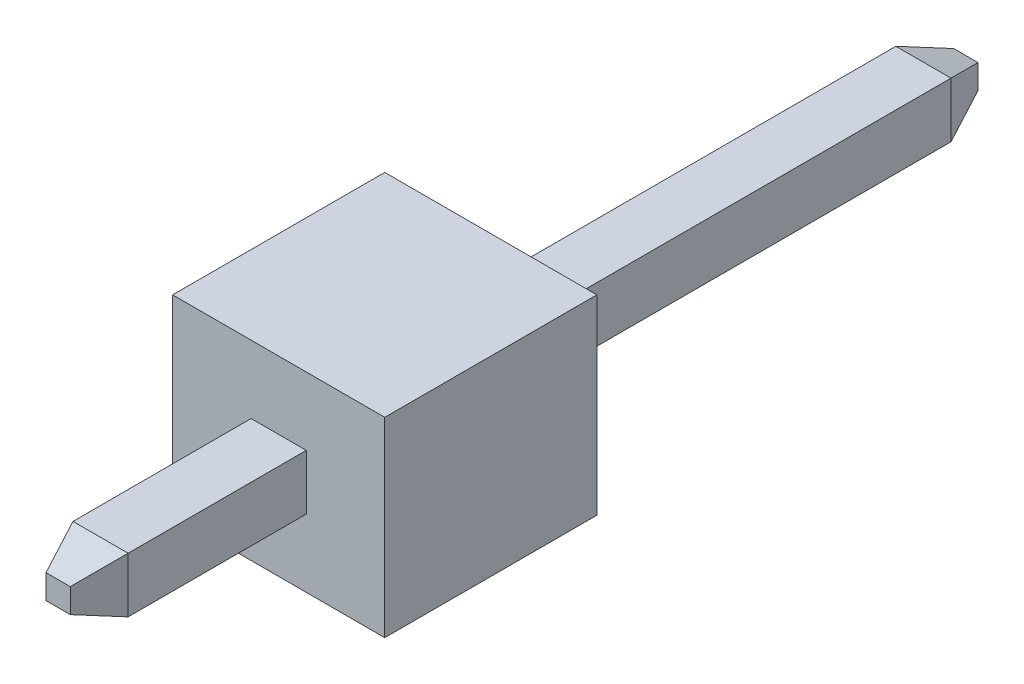
ISO-10303-21;
HEADER;
FILE_DESCRIPTION(('STEP AP214'),'2;1');
FILE_NAME('part.step','',(''),(''),'','','');
FILE_SCHEMA(('AUTOMOTIVE_DESIGN { 1 0 10303 214 1 1 1 1 }'));
ENDSEC;
DATA;
#1=APPLICATION_CONTEXT('core data for automotive mechanical design processes');
#2=APPLICATION_PROTOCOL_DEFINITION('international standard','automotive_design',2000,#1);
#3=PRODUCT_CONTEXT('',#1,'mechanical');
#4=PRODUCT('Part','Part','',(#3));
#5=PRODUCT_RELATED_PRODUCT_CATEGORY('part','',(#4));
#6=PRODUCT_DEFINITION_FORMATION('','',#4);
#7=PRODUCT_DEFINITION_CONTEXT('part definition',#1,'design');
#8=PRODUCT_DEFINITION('design','',#6,#7);
#9=PRODUCT_DEFINITION_SHAPE('','',#8);
#10=(LENGTH_UNIT() NAMED_UNIT(*) SI_UNIT(.MILLI.,.METRE.));
#11=(NAMED_UNIT(*) PLANE_ANGLE_UNIT() SI_UNIT($,.RADIAN.));
#12=(NAMED_UNIT(*) SI_UNIT($,.STERADIAN.) SOLID_ANGLE_UNIT());
#13=UNCERTAINTY_MEASURE_WITH_UNIT(LENGTH_MEASURE(1.E-05),#10,'distance_accuracy_value','');
#14=(GEOMETRIC_REPRESENTATION_CONTEXT(3) GLOBAL_UNCERTAINTY_ASSIGNED_CONTEXT((#13)) GLOBAL_UNIT_ASSIGNED_CONTEXT((#10,
#11,#12)) REPRESENTATION_CONTEXT('',''));
#15=CARTESIAN_POINT('',(0.,0.,0.));
#16=DIRECTION('',(0.,0.,1.));
#17=DIRECTION('',(1.,0.,0.));
#18=AXIS2_PLACEMENT_3D('',#15,#16,#17);
#19=CARTESIAN_POINT('',(-1.25,-1.125,1.25));
#20=DIRECTION('',(1.,0.,0.));
#21=DIRECTION('',(0.,0.,-1.));
#22=AXIS2_PLACEMENT_3D('',#19,#20,#21);
#23=PLANE('',#22);
#24=DIRECTION('',(0.,-1.,0.));
#25=VECTOR('',#24,1.);
#26=CARTESIAN_POINT('',(-1.25,-1.125,-1.25));
#27=LINE('',#26,#25);
#28=CARTESIAN_POINT('',(-1.25,1.125,-1.25));
#29=VERTEX_POINT('',#28);
#30=CARTESIAN_POINT('',(-1.25,-1.125,-1.25));
#31=VERTEX_POINT('',#30);
#32=EDGE_CURVE('E239',#29,#31,#27,.T.);
#33=ORIENTED_EDGE('',*,*,#32,.T.);
#34=DIRECTION('',(0.,0.,-1.));
#35=VECTOR('',#34,1.);
#36=CARTESIAN_POINT('',(-1.25,-1.125,1.25));
#37=LINE('',#36,#35);
#38=CARTESIAN_POINT('',(-1.25,-1.125,1.25));
#39=VERTEX_POINT('',#38);
#40=EDGE_CURVE('E277',#39,#31,#37,.T.);
#41=ORIENTED_EDGE('',*,*,#40,.F.);
#42=DIRECTION('',(0.,-1.,0.));
#43=VECTOR('',#42,1.);
#44=CARTESIAN_POINT('',(-1.25,-1.125,1.25));
#45=LINE('',#44,#43);
#46=CARTESIAN_POINT('',(-1.25,1.125,1.25));
#47=VERTEX_POINT('',#46);
#48=EDGE_CURVE('E240',#47,#39,#45,.T.);
#49=ORIENTED_EDGE('',*,*,#48,.F.);
#50=DIRECTION('',(0.,0.,-1.));
#51=VECTOR('',#50,1.);
#52=CARTESIAN_POINT('',(-1.25,1.125,1.25));
#53=LINE('',#52,#51);
#54=EDGE_CURVE('E254',#47,#29,#53,.T.);
#55=ORIENTED_EDGE('',*,*,#54,.T.);
#56=EDGE_LOOP('',(#33,#41,#49,#55));
#57=FACE_BOUND('',#56,.T.);
#58=ADVANCED_FACE('F39',(#57),#23,.F.);
#59=CARTESIAN_POINT('',(1.25,-1.125,1.25));
#60=DIRECTION('',(0.,1.,0.));
#61=DIRECTION('',(-1.,0.,0.));
#62=AXIS2_PLACEMENT_3D('',#59,#60,#61);
#63=PLANE('',#62);
#64=DIRECTION('',(1.,0.,0.));
#65=VECTOR('',#64,1.);
#66=CARTESIAN_POINT('',(1.25,-1.125,-1.25));
#67=LINE('',#66,#65);
#68=CARTESIAN_POINT('',(1.25,-1.125,-1.25));
#69=VERTEX_POINT('',#68);
#70=EDGE_CURVE('E258',#31,#69,#67,.T.);
#71=ORIENTED_EDGE('',*,*,#70,.T.);
#72=DIRECTION('',(0.,0.,-1.));
#73=VECTOR('',#72,1.);
#74=CARTESIAN_POINT('',(1.25,-1.125,1.25));
#75=LINE('',#74,#73);
#76=CARTESIAN_POINT('',(1.25,-1.125,1.25));
#77=VERTEX_POINT('',#76);
#78=EDGE_CURVE('E273',#77,#69,#75,.T.);
#79=ORIENTED_EDGE('',*,*,#78,.F.);
#80=DIRECTION('',(1.,0.,0.));
#81=VECTOR('',#80,1.);
#82=CARTESIAN_POINT('',(1.25,-1.125,1.25));
#83=LINE('',#82,#81);
#84=EDGE_CURVE('E244',#39,#77,#83,.T.);
#85=ORIENTED_EDGE('',*,*,#84,.F.);
#86=ORIENTED_EDGE('',*,*,#40,.T.);
#87=EDGE_LOOP('',(#71,#79,#85,#86));
#88=FACE_BOUND('',#87,.T.);
#89=ADVANCED_FACE('F376',(#88),#63,.F.);
#90=CARTESIAN_POINT('',(1.25,-1.125,1.25));
#91=DIRECTION('',(-1.,0.,0.));
#92=DIRECTION('',(0.,0.,1.));
#93=AXIS2_PLACEMENT_3D('',#90,#91,#92);
#94=PLANE('',#93);
#95=DIRECTION('',(0.,1.,0.));
#96=VECTOR('',#95,1.);
#97=CARTESIAN_POINT('',(1.25,-1.125,-1.25));
#98=LINE('',#97,#96);
#99=CARTESIAN_POINT('',(1.25,1.125,-1.25));
#100=VERTEX_POINT('',#99);
#101=EDGE_CURVE('E261',#69,#100,#98,.T.);
#102=ORIENTED_EDGE('',*,*,#101,.T.);
#103=DIRECTION('',(0.,0.,-1.));
#104=VECTOR('',#103,1.);
#105=CARTESIAN_POINT('',(1.25,1.125,1.25));
#106=LINE('',#105,#104);
#107=CARTESIAN_POINT('',(1.25,1.125,1.25));
#108=VERTEX_POINT('',#107);
#109=EDGE_CURVE('E269',#108,#100,#106,.T.);
#110=ORIENTED_EDGE('',*,*,#109,.F.);
#111=DIRECTION('',(0.,1.,0.));
#112=VECTOR('',#111,1.);
#113=CARTESIAN_POINT('',(1.25,-1.125,1.25));
#114=LINE('',#113,#112);
#115=EDGE_CURVE('E248',#77,#108,#114,.T.);
#116=ORIENTED_EDGE('',*,*,#115,.F.);
#117=ORIENTED_EDGE('',*,*,#78,.T.);
#118=EDGE_LOOP('',(#102,#110,#116,#117));
#119=FACE_BOUND('',#118,.T.);
#120=ADVANCED_FACE('F381',(#119),#94,.F.);
#121=CARTESIAN_POINT('',(1.25,1.125,1.25));
#122=DIRECTION('',(0.,-1.,0.));
#123=DIRECTION('',(1.,0.,0.));
#124=AXIS2_PLACEMENT_3D('',#121,#122,#123);
#125=PLANE('',#124);
#126=DIRECTION('',(-1.,0.,0.));
#127=VECTOR('',#126,1.);
#128=CARTESIAN_POINT('',(1.25,1.125,-1.25));
#129=LINE('',#128,#127);
#130=EDGE_CURVE('E245',#100,#29,#129,.T.);
#131=ORIENTED_EDGE('',*,*,#130,.T.);
#132=ORIENTED_EDGE('',*,*,#54,.F.);
#133=DIRECTION('',(-1.,0.,0.));
#134=VECTOR('',#133,1.);
#135=CARTESIAN_POINT('',(1.25,1.125,1.25));
#136=LINE('',#135,#134);
#137=EDGE_CURVE('E251',#108,#47,#136,.T.);
#138=ORIENTED_EDGE('',*,*,#137,.F.);
#139=ORIENTED_EDGE('',*,*,#109,.T.);
#140=EDGE_LOOP('',(#131,#132,#138,#139));
#141=FACE_BOUND('',#140,.T.);
#142=ADVANCED_FACE('F396',(#141),#125,.F.);
#143=CARTESIAN_POINT('',(0.,0.,1.25));
#144=DIRECTION('',(0.,0.,1.));
#145=DIRECTION('',(1.,0.,0.));
#146=AXIS2_PLACEMENT_3D('',#143,#144,#145);
#147=PLANE('',#146);
#148=DIRECTION('',(0.,-1.,0.));
#149=VECTOR('',#148,1.);
#150=CARTESIAN_POINT('',(-0.325,0.,1.25));
#151=LINE('',#150,#149);
#152=CARTESIAN_POINT('',(-0.325,0.325,1.25));
#153=VERTEX_POINT('',#152);
#154=CARTESIAN_POINT('',(-0.325,-0.325,1.25));
#155=VERTEX_POINT('',#154);
#156=EDGE_CURVE('E54',#153,#155,#151,.T.);
#157=ORIENTED_EDGE('',*,*,#156,.F.);
#158=DIRECTION('',(-1.,0.,0.));
#159=VECTOR('',#158,1.);
#160=CARTESIAN_POINT('',(0.,0.325,1.25));
#161=LINE('',#160,#159);
#162=CARTESIAN_POINT('',(0.325,0.325,1.25));
#163=VERTEX_POINT('',#162);
#164=EDGE_CURVE('E58',#163,#153,#161,.T.);
#165=ORIENTED_EDGE('',*,*,#164,.F.);
#166=DIRECTION('',(0.,1.,0.));
#167=VECTOR('',#166,1.);
#168=CARTESIAN_POINT('',(0.325,0.,1.25));
#169=LINE('',#168,#167);
#170=CARTESIAN_POINT('',(0.325,-0.325,1.25));
#171=VERTEX_POINT('',#170);
#172=EDGE_CURVE('E232',#171,#163,#169,.T.);
#173=ORIENTED_EDGE('',*,*,#172,.F.);
#174=DIRECTION('',(1.,0.,0.));
#175=VECTOR('',#174,1.);
#176=CARTESIAN_POINT('',(0.,-0.325,1.25));
#177=LINE('',#176,#175);
#178=EDGE_CURVE('E216',#155,#171,#177,.T.);
#179=ORIENTED_EDGE('',*,*,#178,.F.);
#180=EDGE_LOOP('',(#157,#165,#173,#179));
#181=FACE_BOUND('',#180,.T.);
#182=ORIENTED_EDGE('',*,*,#48,.T.);
#183=ORIENTED_EDGE('',*,*,#84,.T.);
#184=ORIENTED_EDGE('',*,*,#115,.T.);
#185=ORIENTED_EDGE('',*,*,#137,.T.);
#186=EDGE_LOOP('',(#182,#183,#184,#185));
#187=FACE_BOUND('',#186,.T.);
#188=ADVANCED_FACE('F392',(#181,#187),#147,.T.);
#189=CARTESIAN_POINT('',(0.,0.,-1.25));
#190=DIRECTION('',(0.,0.,1.));
#191=DIRECTION('',(1.,0.,0.));
#192=AXIS2_PLACEMENT_3D('',#189,#190,#191);
#193=PLANE('',#192);
#194=DIRECTION('',(-1.,0.,0.));
#195=VECTOR('',#194,1.);
#196=CARTESIAN_POINT('',(0.,0.325,-1.25));
#197=LINE('',#196,#195);
#198=CARTESIAN_POINT('',(0.325,0.325,-1.25));
#199=VERTEX_POINT('',#198);
#200=CARTESIAN_POINT('',(-0.325,0.325,-1.25));
#201=VERTEX_POINT('',#200);
#202=EDGE_CURVE('E47',#199,#201,#197,.T.);
#203=ORIENTED_EDGE('',*,*,#202,.T.);
#204=DIRECTION('',(0.,-1.,0.));
#205=VECTOR('',#204,1.);
#206=CARTESIAN_POINT('',(-0.325,0.,-1.25));
#207=LINE('',#206,#205);
#208=CARTESIAN_POINT('',(-0.325,-0.325,-1.25));
#209=VERTEX_POINT('',#208);
#210=EDGE_CURVE('E11',#201,#209,#207,.T.);
#211=ORIENTED_EDGE('',*,*,#210,.T.);
#212=DIRECTION('',(1.,0.,0.));
#213=VECTOR('',#212,1.);
#214=CARTESIAN_POINT('',(0.,-0.325,-1.25));
#215=LINE('',#214,#213);
#216=CARTESIAN_POINT('',(0.325,-0.325,-1.25));
#217=VERTEX_POINT('',#216);
#218=EDGE_CURVE('E281',#209,#217,#215,.T.);
#219=ORIENTED_EDGE('',*,*,#218,.T.);
#220=DIRECTION('',(0.,1.,0.));
#221=VECTOR('',#220,1.);
#222=CARTESIAN_POINT('',(0.325,0.,-1.25));
#223=LINE('',#222,#221);
#224=EDGE_CURVE('E285',#217,#199,#223,.T.);
#225=ORIENTED_EDGE('',*,*,#224,.T.);
#226=EDGE_LOOP('',(#203,#211,#219,#225));
#227=FACE_BOUND('',#226,.T.);
#228=ORIENTED_EDGE('',*,*,#32,.F.);
#229=ORIENTED_EDGE('',*,*,#130,.F.);
#230=ORIENTED_EDGE('',*,*,#101,.F.);
#231=ORIENTED_EDGE('',*,*,#70,.F.);
#232=EDGE_LOOP('',(#228,#229,#230,#231));
#233=FACE_BOUND('',#232,.T.);
#234=ADVANCED_FACE('F291',(#227,#233),#193,.F.);
#235=CARTESIAN_POINT('',(0.325,-0.325,-6.35));
#236=DIRECTION('',(0.,-1.,0.));
#237=DIRECTION('',(0.,0.,-1.));
#238=AXIS2_PLACEMENT_3D('',#235,#236,#237);
#239=PLANE('',#238);
#240=ORIENTED_EDGE('',*,*,#218,.F.);
#241=DIRECTION('',(0.,0.,1.));
#242=VECTOR('',#241,1.);
#243=CARTESIAN_POINT('',(-0.325,-0.325,-6.35));
#244=LINE('',#243,#242);
#245=CARTESIAN_POINT('',(-0.325,-0.325,-6.35));
#246=VERTEX_POINT('',#245);
#247=EDGE_CURVE('E225',#246,#209,#244,.T.);
#248=ORIENTED_EDGE('',*,*,#247,.F.);
#249=DIRECTION('',(1.,0.,0.));
#250=VECTOR('',#249,1.);
#251=CARTESIAN_POINT('',(0.325,-0.325,-6.35));
#252=LINE('',#251,#250);
#253=CARTESIAN_POINT('',(0.325,-0.325,-6.35));
#254=VERTEX_POINT('',#253);
#255=EDGE_CURVE('E198',#246,#254,#252,.T.);
#256=ORIENTED_EDGE('',*,*,#255,.T.);
#257=DIRECTION('',(0.,0.,1.));
#258=VECTOR('',#257,1.);
#259=CARTESIAN_POINT('',(0.325,-0.325,-6.35));
#260=LINE('',#259,#258);
#261=EDGE_CURVE('E221',#254,#217,#260,.T.);
#262=ORIENTED_EDGE('',*,*,#261,.T.);
#263=EDGE_LOOP('',(#240,#248,#256,#262));
#264=FACE_BOUND('',#263,.T.);
#265=ADVANCED_FACE('F407',(#264),#239,.T.);
#266=CARTESIAN_POINT('',(0.325,-0.325,-6.35));
#267=DIRECTION('',(1.,0.,0.));
#268=DIRECTION('',(0.,0.,-1.));
#269=AXIS2_PLACEMENT_3D('',#266,#267,#268);
#270=PLANE('',#269);
#271=ORIENTED_EDGE('',*,*,#224,.F.);
#272=ORIENTED_EDGE('',*,*,#261,.F.);
#273=DIRECTION('',(0.,1.,0.));
#274=VECTOR('',#273,1.);
#275=CARTESIAN_POINT('',(0.325,-0.325,-6.35));
#276=LINE('',#275,#274);
#277=CARTESIAN_POINT('',(0.325,0.325,-6.35));
#278=VERTEX_POINT('',#277);
#279=EDGE_CURVE('E206',#254,#278,#276,.T.);
#280=ORIENTED_EDGE('',*,*,#279,.T.);
#281=DIRECTION('',(0.,0.,1.));
#282=VECTOR('',#281,1.);
#283=CARTESIAN_POINT('',(0.325,0.325,-6.35));
#284=LINE('',#283,#282);
#285=EDGE_CURVE('E174',#278,#199,#284,.T.);
#286=ORIENTED_EDGE('',*,*,#285,.T.);
#287=EDGE_LOOP('',(#271,#272,#280,#286));
#288=FACE_BOUND('',#287,.T.);
#289=ADVANCED_FACE('F299',(#288),#270,.T.);
#290=CARTESIAN_POINT('',(0.325,0.325,-6.35));
#291=DIRECTION('',(0.,1.,0.));
#292=DIRECTION('',(0.,0.,1.));
#293=AXIS2_PLACEMENT_3D('',#290,#291,#292);
#294=PLANE('',#293);
#295=ORIENTED_EDGE('',*,*,#202,.F.);
#296=ORIENTED_EDGE('',*,*,#285,.F.);
#297=DIRECTION('',(-1.,0.,0.));
#298=VECTOR('',#297,1.);
#299=CARTESIAN_POINT('',(0.325,0.325,-6.35));
#300=LINE('',#299,#298);
#301=CARTESIAN_POINT('',(-0.325,0.325,-6.35));
#302=VERTEX_POINT('',#301);
#303=EDGE_CURVE('E210',#278,#302,#300,.T.);
#304=ORIENTED_EDGE('',*,*,#303,.T.);
#305=DIRECTION('',(0.,0.,1.));
#306=VECTOR('',#305,1.);
#307=CARTESIAN_POINT('',(-0.325,0.325,-6.35));
#308=LINE('',#307,#306);
#309=EDGE_CURVE('E173',#302,#201,#308,.T.);
#310=ORIENTED_EDGE('',*,*,#309,.T.);
#311=EDGE_LOOP('',(#295,#296,#304,#310));
#312=FACE_BOUND('',#311,.T.);
#313=ADVANCED_FACE('F296',(#312),#294,.T.);
#314=CARTESIAN_POINT('',(-0.325,-0.325,-6.35));
#315=DIRECTION('',(-1.,0.,0.));
#316=DIRECTION('',(0.,0.,1.));
#317=AXIS2_PLACEMENT_3D('',#314,#315,#316);
#318=PLANE('',#317);
#319=ORIENTED_EDGE('',*,*,#210,.F.);
#320=ORIENTED_EDGE('',*,*,#309,.F.);
#321=DIRECTION('',(0.,-1.,0.));
#322=VECTOR('',#321,1.);
#323=CARTESIAN_POINT('',(-0.325,-0.325,-6.35));
#324=LINE('',#323,#322);
#325=EDGE_CURVE('E192',#302,#246,#324,.T.);
#326=ORIENTED_EDGE('',*,*,#325,.T.);
#327=ORIENTED_EDGE('',*,*,#247,.T.);
#328=EDGE_LOOP('',(#319,#320,#326,#327));
#329=FACE_BOUND('',#328,.T.);
#330=ADVANCED_FACE('F412',(#329),#318,.T.);
#331=CARTESIAN_POINT('',(-0.325,0.325,3.35));
#332=VERTEX_POINT('',#331);
#333=EDGE_CURVE('E153',#153,#332,#308,.T.);
#334=ORIENTED_EDGE('',*,*,#333,.F.);
#335=ORIENTED_EDGE('',*,*,#156,.T.);
#336=CARTESIAN_POINT('',(-0.325,-0.325,3.35));
#337=VERTEX_POINT('',#336);
#338=EDGE_CURVE('E155',#155,#337,#244,.T.);
#339=ORIENTED_EDGE('',*,*,#338,.T.);
#340=DIRECTION('',(0.,-1.,0.));
#341=VECTOR('',#340,1.);
#342=CARTESIAN_POINT('',(-0.325,-0.325,3.35));
#343=LINE('',#342,#341);
#344=EDGE_CURVE('E150',#332,#337,#343,.T.);
#345=ORIENTED_EDGE('',*,*,#344,.F.);
#346=EDGE_LOOP('',(#334,#335,#339,#345));
#347=FACE_BOUND('',#346,.T.);
#348=ADVANCED_FACE('F152',(#347),#318,.T.);
#349=CARTESIAN_POINT('',(0.325,0.325,3.35));
#350=VERTEX_POINT('',#349);
#351=EDGE_CURVE('E220',#163,#350,#284,.T.);
#352=ORIENTED_EDGE('',*,*,#351,.F.);
#353=ORIENTED_EDGE('',*,*,#164,.T.);
#354=ORIENTED_EDGE('',*,*,#333,.T.);
#355=DIRECTION('',(-1.,0.,0.));
#356=VECTOR('',#355,1.);
#357=CARTESIAN_POINT('',(0.325,0.325,3.35));
#358=LINE('',#357,#356);
#359=EDGE_CURVE('E170',#350,#332,#358,.T.);
#360=ORIENTED_EDGE('',*,*,#359,.F.);
#361=EDGE_LOOP('',(#352,#353,#354,#360));
#362=FACE_BOUND('',#361,.T.);
#363=ADVANCED_FACE('F168',(#362),#294,.T.);
#364=CARTESIAN_POINT('',(0.325,-0.325,3.35));
#365=VERTEX_POINT('',#364);
#366=EDGE_CURVE('E224',#171,#365,#260,.T.);
#367=ORIENTED_EDGE('',*,*,#366,.F.);
#368=ORIENTED_EDGE('',*,*,#172,.T.);
#369=ORIENTED_EDGE('',*,*,#351,.T.);
#370=DIRECTION('',(0.,1.,0.));
#371=VECTOR('',#370,1.);
#372=CARTESIAN_POINT('',(0.325,-0.325,3.35));
#373=LINE('',#372,#371);
#374=EDGE_CURVE('E193',#365,#350,#373,.T.);
#375=ORIENTED_EDGE('',*,*,#374,.F.);
#376=EDGE_LOOP('',(#367,#368,#369,#375));
#377=FACE_BOUND('',#376,.T.);
#378=ADVANCED_FACE('F416',(#377),#270,.T.);
#379=ORIENTED_EDGE('',*,*,#338,.F.);
#380=ORIENTED_EDGE('',*,*,#178,.T.);
#381=ORIENTED_EDGE('',*,*,#366,.T.);
#382=DIRECTION('',(1.,0.,0.));
#383=VECTOR('',#382,1.);
#384=CARTESIAN_POINT('',(0.325,-0.325,3.35));
#385=LINE('',#384,#383);
#386=EDGE_CURVE('E162',#337,#365,#385,.T.);
#387=ORIENTED_EDGE('',*,*,#386,.F.);
#388=EDGE_LOOP('',(#379,#380,#381,#387));
#389=FACE_BOUND('',#388,.T.);
#390=ADVANCED_FACE('F413',(#389),#239,.T.);
#391=CARTESIAN_POINT('',(0.325,-0.325,-6.35));
#392=DIRECTION('',(0.939692620785908,0.,-0.342020143325669));
#393=DIRECTION('',(-0.342020143325669,0.,-0.939692620785908));
#394=AXIS2_PLACEMENT_3D('',#391,#392,#393);
#395=PLANE('',#394);
#396=ORIENTED_EDGE('',*,*,#279,.F.);
#397=DIRECTION('',(0.323615577118185,-0.323615577118185,0.889126490715988));
#398=VECTOR('',#397,1.);
#399=CARTESIAN_POINT('',(0.256927422860201,-0.256927422860201,-6.53702786857568));
#400=LINE('',#399,#398);
#401=CARTESIAN_POINT('',(0.143014882866898,-0.143014882866898,-6.85));
#402=VERTEX_POINT('',#401);
#403=EDGE_CURVE('E163',#402,#254,#400,.T.);
#404=ORIENTED_EDGE('',*,*,#403,.F.);
#405=DIRECTION('',(0.,1.,0.));
#406=VECTOR('',#405,1.);
#407=CARTESIAN_POINT('',(0.143014882866898,-0.325,-6.85));
#408=LINE('',#407,#406);
#409=CARTESIAN_POINT('',(0.143014882866898,0.143014882866898,-6.85));
#410=VERTEX_POINT('',#409);
#411=EDGE_CURVE('E184',#410,#402,#408,.F.);
#412=ORIENTED_EDGE('',*,*,#411,.F.);
#413=DIRECTION('',(0.323615577118185,0.323615577118185,0.889126490715988));
#414=VECTOR('',#413,1.);
#415=CARTESIAN_POINT('',(0.256927422860201,0.256927422860201,-6.53702786857568));
#416=LINE('',#415,#414);
#417=EDGE_CURVE('E308',#410,#278,#416,.T.);
#418=ORIENTED_EDGE('',*,*,#417,.T.);
#419=EDGE_LOOP('',(#396,#404,#412,#418));
#420=FACE_BOUND('',#419,.T.);
#421=ADVANCED_FACE('F305',(#420),#395,.T.);
#422=CARTESIAN_POINT('',(-0.325,-0.325,-6.35));
#423=DIRECTION('',(0.,-0.939692620785908,-0.342020143325669));
#424=DIRECTION('',(0.,0.342020143325669,-0.939692620785908));
#425=AXIS2_PLACEMENT_3D('',#422,#423,#424);
#426=PLANE('',#425);
#427=ORIENTED_EDGE('',*,*,#255,.F.);
#428=DIRECTION('',(-0.323615577118185,-0.323615577118185,0.889126490715988));
#429=VECTOR('',#428,1.);
#430=CARTESIAN_POINT('',(-0.325,-0.325,-6.35));
#431=LINE('',#430,#429);
#432=CARTESIAN_POINT('',(-0.143014882866898,-0.143014882866898,-6.85));
#433=VERTEX_POINT('',#432);
#434=EDGE_CURVE('E316',#433,#246,#431,.T.);
#435=ORIENTED_EDGE('',*,*,#434,.F.);
#436=DIRECTION('',(1.,0.,0.));
#437=VECTOR('',#436,1.);
#438=CARTESIAN_POINT('',(-0.325,-0.143014882866898,-6.85));
#439=LINE('',#438,#437);
#440=EDGE_CURVE('E313',#402,#433,#439,.F.);
#441=ORIENTED_EDGE('',*,*,#440,.F.);
#442=ORIENTED_EDGE('',*,*,#403,.T.);
#443=EDGE_LOOP('',(#427,#435,#441,#442));
#444=FACE_BOUND('',#443,.T.);
#445=ADVANCED_FACE('F310',(#444),#426,.T.);
#446=CARTESIAN_POINT('',(-0.325,-0.325,-6.35));
#447=DIRECTION('',(-0.939692620785908,0.,-0.342020143325669));
#448=DIRECTION('',(-0.342020143325669,0.,0.939692620785908));
#449=AXIS2_PLACEMENT_3D('',#446,#447,#448);
#450=PLANE('',#449);
#451=ORIENTED_EDGE('',*,*,#325,.F.);
#452=DIRECTION('',(-0.323615577118185,0.323615577118185,0.889126490715988));
#453=VECTOR('',#452,1.);
#454=CARTESIAN_POINT('',(-0.325,0.325,-6.35));
#455=LINE('',#454,#453);
#456=CARTESIAN_POINT('',(-0.143014882866898,0.143014882866898,-6.85));
#457=VERTEX_POINT('',#456);
#458=EDGE_CURVE('E319',#457,#302,#455,.T.);
#459=ORIENTED_EDGE('',*,*,#458,.F.);
#460=DIRECTION('',(0.,-1.,0.));
#461=VECTOR('',#460,1.);
#462=CARTESIAN_POINT('',(-0.143014882866898,-0.325,-6.85));
#463=LINE('',#462,#461);
#464=EDGE_CURVE('E335',#433,#457,#463,.F.);
#465=ORIENTED_EDGE('',*,*,#464,.F.);
#466=ORIENTED_EDGE('',*,*,#434,.T.);
#467=EDGE_LOOP('',(#451,#459,#465,#466));
#468=FACE_BOUND('',#467,.T.);
#469=ADVANCED_FACE('F424',(#468),#450,.T.);
#470=CARTESIAN_POINT('',(-0.325,0.325,-6.35));
#471=DIRECTION('',(0.,0.939692620785908,-0.342020143325669));
#472=DIRECTION('',(0.,0.342020143325669,0.939692620785908));
#473=AXIS2_PLACEMENT_3D('',#470,#471,#472);
#474=PLANE('',#473);
#475=ORIENTED_EDGE('',*,*,#303,.F.);
#476=ORIENTED_EDGE('',*,*,#417,.F.);
#477=DIRECTION('',(-1.,0.,0.));
#478=VECTOR('',#477,1.);
#479=CARTESIAN_POINT('',(-0.325,0.143014882866898,-6.85));
#480=LINE('',#479,#478);
#481=EDGE_CURVE('E327',#457,#410,#480,.F.);
#482=ORIENTED_EDGE('',*,*,#481,.F.);
#483=ORIENTED_EDGE('',*,*,#458,.T.);
#484=EDGE_LOOP('',(#475,#476,#482,#483));
#485=FACE_BOUND('',#484,.T.);
#486=ADVANCED_FACE('F427',(#485),#474,.T.);
#487=CARTESIAN_POINT('',(0.,0.,-6.85));
#488=DIRECTION('',(0.,0.,-1.));
#489=DIRECTION('',(-1.,0.,0.));
#490=AXIS2_PLACEMENT_3D('',#487,#488,#489);
#491=PLANE('',#490);
#492=ORIENTED_EDGE('',*,*,#411,.T.);
#493=ORIENTED_EDGE('',*,*,#440,.T.);
#494=ORIENTED_EDGE('',*,*,#464,.T.);
#495=ORIENTED_EDGE('',*,*,#481,.T.);
#496=EDGE_LOOP('',(#492,#493,#494,#495));
#497=FACE_BOUND('',#496,.T.);
#498=ADVANCED_FACE('F431',(#497),#491,.T.);
#499=CARTESIAN_POINT('',(0.325,0.325,3.35));
#500=DIRECTION('',(0.,0.939692620785908,0.342020143325669));
#501=DIRECTION('',(0.,-0.342020143325669,0.939692620785908));
#502=AXIS2_PLACEMENT_3D('',#499,#500,#501);
#503=PLANE('',#502);
#504=ORIENTED_EDGE('',*,*,#359,.T.);
#505=DIRECTION('',(-0.323615577118185,0.323615577118185,-0.889126490715988));
#506=VECTOR('',#505,1.);
#507=CARTESIAN_POINT('',(-0.325,0.325,3.35));
#508=LINE('',#507,#506);
#509=CARTESIAN_POINT('',(-0.143014882866898,0.143014882866898,3.85));
#510=VERTEX_POINT('',#509);
#511=EDGE_CURVE('E177',#510,#332,#508,.T.);
#512=ORIENTED_EDGE('',*,*,#511,.F.);
#513=DIRECTION('',(1.,0.,0.));
#514=VECTOR('',#513,1.);
#515=CARTESIAN_POINT('',(0.325,0.143014882866898,3.85));
#516=LINE('',#515,#514);
#517=CARTESIAN_POINT('',(0.143014882866898,0.143014882866898,3.85));
#518=VERTEX_POINT('',#517);
#519=EDGE_CURVE('E359',#518,#510,#516,.F.);
#520=ORIENTED_EDGE('',*,*,#519,.F.);
#521=DIRECTION('',(0.323615577118185,0.323615577118185,-0.889126490715988));
#522=VECTOR('',#521,1.);
#523=CARTESIAN_POINT('',(0.325,0.325,3.35));
#524=LINE('',#523,#522);
#525=EDGE_CURVE('E190',#518,#350,#524,.T.);
#526=ORIENTED_EDGE('',*,*,#525,.T.);
#527=EDGE_LOOP('',(#504,#512,#520,#526));
#528=FACE_BOUND('',#527,.T.);
#529=ADVANCED_FACE('F188',(#528),#503,.T.);
#530=CARTESIAN_POINT('',(-0.325,0.325,3.35));
#531=DIRECTION('',(-0.939692620785908,0.,0.342020143325669));
#532=DIRECTION('',(0.342020143325669,0.,0.939692620785908));
#533=AXIS2_PLACEMENT_3D('',#530,#531,#532);
#534=PLANE('',#533);
#535=ORIENTED_EDGE('',*,*,#344,.T.);
#536=DIRECTION('',(-0.323615577118185,-0.323615577118185,-0.889126490715988));
#537=VECTOR('',#536,1.);
#538=CARTESIAN_POINT('',(-0.325,-0.325,3.35));
#539=LINE('',#538,#537);
#540=CARTESIAN_POINT('',(-0.143014882866898,-0.143014882866898,3.85));
#541=VERTEX_POINT('',#540);
#542=EDGE_CURVE('E185',#541,#337,#539,.T.);
#543=ORIENTED_EDGE('',*,*,#542,.F.);
#544=DIRECTION('',(0.,1.,0.));
#545=VECTOR('',#544,1.);
#546=CARTESIAN_POINT('',(-0.143014882866898,0.325,3.85));
#547=LINE('',#546,#545);
#548=EDGE_CURVE('E179',#510,#541,#547,.F.);
#549=ORIENTED_EDGE('',*,*,#548,.F.);
#550=ORIENTED_EDGE('',*,*,#511,.T.);
#551=EDGE_LOOP('',(#535,#543,#549,#550));
#552=FACE_BOUND('',#551,.T.);
#553=ADVANCED_FACE('F178',(#552),#534,.T.);
#554=CARTESIAN_POINT('',(-0.325,-0.325,3.35));
#555=DIRECTION('',(0.,-0.939692620785908,0.342020143325669));
#556=DIRECTION('',(0.,-0.342020143325669,-0.939692620785908));
#557=AXIS2_PLACEMENT_3D('',#554,#555,#556);
#558=PLANE('',#557);
#559=ORIENTED_EDGE('',*,*,#386,.T.);
#560=DIRECTION('',(0.323615577118185,-0.323615577118185,-0.889126490715988));
#561=VECTOR('',#560,1.);
#562=CARTESIAN_POINT('',(0.325,-0.325,3.35));
#563=LINE('',#562,#561);
#564=CARTESIAN_POINT('',(0.143014882866898,-0.143014882866898,3.85));
#565=VERTEX_POINT('',#564);
#566=EDGE_CURVE('E346',#565,#365,#563,.T.);
#567=ORIENTED_EDGE('',*,*,#566,.F.);
#568=DIRECTION('',(-1.,0.,0.));
#569=VECTOR('',#568,1.);
#570=CARTESIAN_POINT('',(-0.325,-0.143014882866898,3.85));
#571=LINE('',#570,#569);
#572=EDGE_CURVE('E363',#541,#565,#571,.F.);
#573=ORIENTED_EDGE('',*,*,#572,.F.);
#574=ORIENTED_EDGE('',*,*,#542,.T.);
#575=EDGE_LOOP('',(#559,#567,#573,#574));
#576=FACE_BOUND('',#575,.T.);
#577=ADVANCED_FACE('F344',(#576),#558,.T.);
#578=CARTESIAN_POINT('',(0.325,-0.325,3.35));
#579=DIRECTION('',(0.939692620785908,0.,0.342020143325669));
#580=DIRECTION('',(0.342020143325669,0.,-0.939692620785908));
#581=AXIS2_PLACEMENT_3D('',#578,#579,#580);
#582=PLANE('',#581);
#583=ORIENTED_EDGE('',*,*,#374,.T.);
#584=ORIENTED_EDGE('',*,*,#525,.F.);
#585=DIRECTION('',(0.,-1.,0.));
#586=VECTOR('',#585,1.);
#587=CARTESIAN_POINT('',(0.143014882866898,-0.325,3.85));
#588=LINE('',#587,#586);
#589=EDGE_CURVE('E323',#565,#518,#588,.F.);
#590=ORIENTED_EDGE('',*,*,#589,.F.);
#591=ORIENTED_EDGE('',*,*,#566,.T.);
#592=EDGE_LOOP('',(#583,#584,#590,#591));
#593=FACE_BOUND('',#592,.T.);
#594=ADVANCED_FACE('F350',(#593),#582,.T.);
#595=CARTESIAN_POINT('',(0.,0.,3.85));
#596=DIRECTION('',(0.,0.,1.));
#597=DIRECTION('',(1.,0.,0.));
#598=AXIS2_PLACEMENT_3D('',#595,#596,#597);
#599=PLANE('',#598);
#600=ORIENTED_EDGE('',*,*,#519,.T.);
#601=ORIENTED_EDGE('',*,*,#548,.T.);
#602=ORIENTED_EDGE('',*,*,#572,.T.);
#603=ORIENTED_EDGE('',*,*,#589,.T.);
#604=EDGE_LOOP('',(#600,#601,#602,#603));
#605=FACE_BOUND('',#604,.T.);
#606=ADVANCED_FACE('F367',(#605),#599,.T.);
#607=CLOSED_SHELL('',(#58,#89,#120,#142,#188,#234,#265,#289,#313,#330,#348,#363,#378,#390,#421,
#445,#469,#486,#498,#529,#553,#577,#594,#606));
#608=MANIFOLD_SOLID_BREP('B2',#607);
#609=ADVANCED_BREP_SHAPE_REPRESENTATION('',(#18,#608),#14);
#610=SHAPE_DEFINITION_REPRESENTATION(#9,#609);
ENDSEC;
END-ISO-10303-21;
